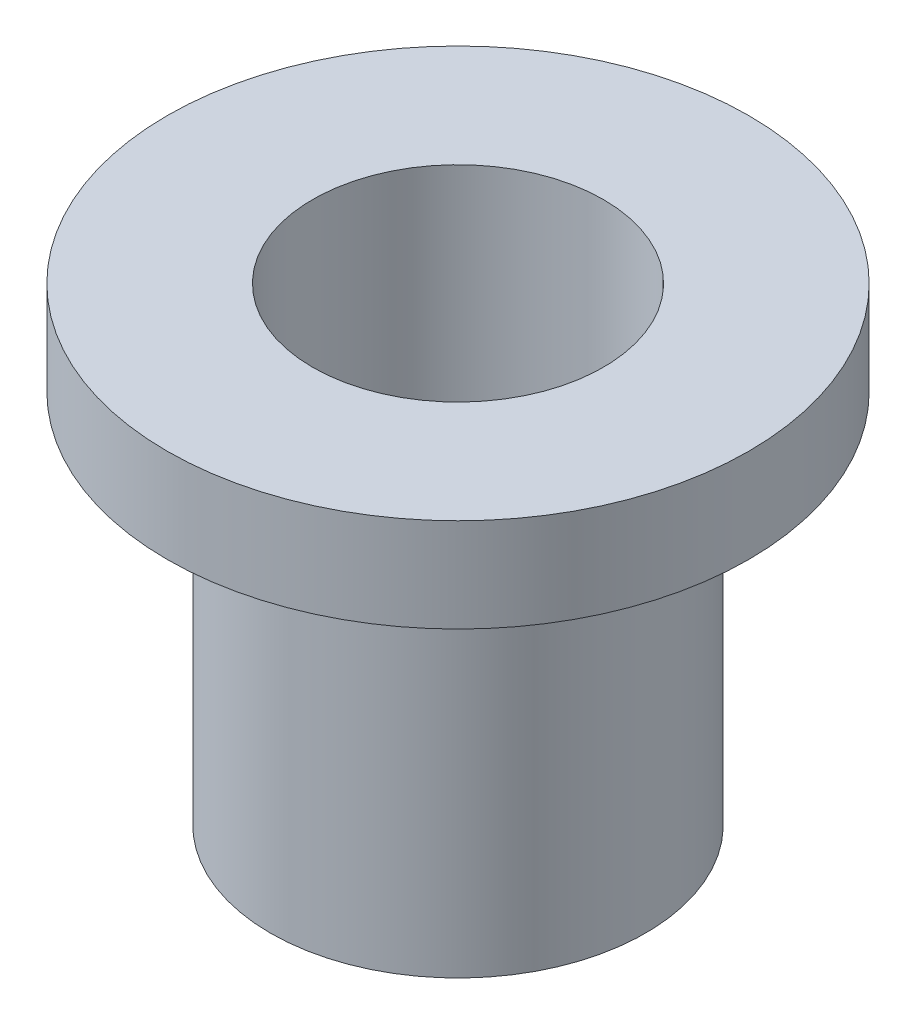
ISO-10303-21;
HEADER;
FILE_DESCRIPTION(('STEP AP214'),'2;1');
FILE_NAME('part.step','',(''),(''),'','','');
FILE_SCHEMA(('AUTOMOTIVE_DESIGN { 1 0 10303 214 1 1 1 1 }'));
ENDSEC;
DATA;
#1=APPLICATION_CONTEXT('core data for automotive mechanical design processes');
#2=APPLICATION_PROTOCOL_DEFINITION('international standard','automotive_design',2000,#1);
#3=PRODUCT_CONTEXT('',#1,'mechanical');
#4=PRODUCT('Part','Part','',(#3));
#5=PRODUCT_RELATED_PRODUCT_CATEGORY('part','',(#4));
#6=PRODUCT_DEFINITION_FORMATION('','',#4);
#7=PRODUCT_DEFINITION_CONTEXT('part definition',#1,'design');
#8=PRODUCT_DEFINITION('design','',#6,#7);
#9=PRODUCT_DEFINITION_SHAPE('','',#8);
#10=(LENGTH_UNIT() NAMED_UNIT(*) SI_UNIT(.MILLI.,.METRE.));
#11=(NAMED_UNIT(*) PLANE_ANGLE_UNIT() SI_UNIT($,.RADIAN.));
#12=(NAMED_UNIT(*) SI_UNIT($,.STERADIAN.) SOLID_ANGLE_UNIT());
#13=UNCERTAINTY_MEASURE_WITH_UNIT(LENGTH_MEASURE(1.E-05),#10,'distance_accuracy_value','');
#14=(GEOMETRIC_REPRESENTATION_CONTEXT(3) GLOBAL_UNCERTAINTY_ASSIGNED_CONTEXT((#13)) GLOBAL_UNIT_ASSIGNED_CONTEXT((#10,
#11,#12)) REPRESENTATION_CONTEXT('',''));
#15=CARTESIAN_POINT('',(0.,0.,0.));
#16=DIRECTION('',(0.,0.,1.));
#17=DIRECTION('',(1.,0.,0.));
#18=AXIS2_PLACEMENT_3D('',#15,#16,#17);
#19=CARTESIAN_POINT('',(0.,8.76171662125341,0.));
#20=DIRECTION('',(0.,1.,0.));
#21=DIRECTION('',(0.,0.,1.));
#22=AXIS2_PLACEMENT_3D('',#19,#20,#21);
#23=CYLINDRICAL_SURFACE('',#22,1.55);
#24=CARTESIAN_POINT('',(0.,-2.5,0.));
#25=DIRECTION('',(0.,1.,0.));
#26=DIRECTION('',(0.,0.,1.));
#27=AXIS2_PLACEMENT_3D('',#24,#25,#26);
#28=CIRCLE('',#27,1.55);
#29=CARTESIAN_POINT('',(0.,-2.5,1.55));
#30=VERTEX_POINT('',#29);
#31=EDGE_CURVE('E55',#30,#30,#28,.T.);
#32=ORIENTED_EDGE('',*,*,#31,.F.);
#33=EDGE_LOOP('',(#32));
#34=FACE_BOUND('',#33,.T.);
#35=CARTESIAN_POINT('',(0.,2.5,0.));
#36=DIRECTION('',(0.,1.,0.));
#37=DIRECTION('',(0.,0.,1.));
#38=AXIS2_PLACEMENT_3D('',#35,#36,#37);
#39=CIRCLE('',#38,1.55);
#40=CARTESIAN_POINT('',(0.,2.5,1.55));
#41=VERTEX_POINT('',#40);
#42=EDGE_CURVE('E10',#41,#41,#39,.T.);
#43=ORIENTED_EDGE('',*,*,#42,.T.);
#44=EDGE_LOOP('',(#43));
#45=FACE_BOUND('',#44,.T.);
#46=ADVANCED_FACE('F33',(#34,#45),#23,.F.);
#47=CARTESIAN_POINT('',(0.,2.5,-1.55));
#48=DIRECTION('',(0.,-1.,0.));
#49=DIRECTION('',(0.,0.,-1.));
#50=AXIS2_PLACEMENT_3D('',#47,#48,#49);
#51=PLANE('',#50);
#52=ORIENTED_EDGE('',*,*,#42,.F.);
#53=EDGE_LOOP('',(#52));
#54=FACE_BOUND('',#53,.T.);
#55=CARTESIAN_POINT('',(0.,2.5,0.));
#56=DIRECTION('',(0.,1.,0.));
#57=DIRECTION('',(0.,0.,1.));
#58=AXIS2_PLACEMENT_3D('',#55,#56,#57);
#59=CIRCLE('',#58,3.1);
#60=CARTESIAN_POINT('',(0.,2.5,3.1));
#61=VERTEX_POINT('',#60);
#62=EDGE_CURVE('E39',#61,#61,#59,.T.);
#63=ORIENTED_EDGE('',*,*,#62,.T.);
#64=EDGE_LOOP('',(#63));
#65=FACE_BOUND('',#64,.T.);
#66=ADVANCED_FACE('F62',(#54,#65),#51,.F.);
#67=CARTESIAN_POINT('',(0.,8.76171662125341,0.));
#68=DIRECTION('',(0.,1.,0.));
#69=DIRECTION('',(0.,0.,1.));
#70=AXIS2_PLACEMENT_3D('',#67,#68,#69);
#71=CYLINDRICAL_SURFACE('',#70,3.1);
#72=ORIENTED_EDGE('',*,*,#62,.F.);
#73=EDGE_LOOP('',(#72));
#74=FACE_BOUND('',#73,.T.);
#75=CARTESIAN_POINT('',(0.,1.5,0.));
#76=DIRECTION('',(0.,1.,0.));
#77=DIRECTION('',(0.,0.,1.));
#78=AXIS2_PLACEMENT_3D('',#75,#76,#77);
#79=CIRCLE('',#78,3.1);
#80=CARTESIAN_POINT('',(0.,1.5,3.1));
#81=VERTEX_POINT('',#80);
#82=EDGE_CURVE('E43',#81,#81,#79,.T.);
#83=ORIENTED_EDGE('',*,*,#82,.T.);
#84=EDGE_LOOP('',(#83));
#85=FACE_BOUND('',#84,.T.);
#86=ADVANCED_FACE('F66',(#74,#85),#71,.T.);
#87=CARTESIAN_POINT('',(0.,1.5,-3.1));
#88=DIRECTION('',(0.,1.,0.));
#89=DIRECTION('',(0.,0.,1.));
#90=AXIS2_PLACEMENT_3D('',#87,#88,#89);
#91=PLANE('',#90);
#92=ORIENTED_EDGE('',*,*,#82,.F.);
#93=EDGE_LOOP('',(#92));
#94=FACE_BOUND('',#93,.T.);
#95=CARTESIAN_POINT('',(0.,1.5,0.));
#96=DIRECTION('',(0.,1.,0.));
#97=DIRECTION('',(0.,0.,1.));
#98=AXIS2_PLACEMENT_3D('',#95,#96,#97);
#99=CIRCLE('',#98,2.);
#100=CARTESIAN_POINT('',(0.,1.5,2.));
#101=VERTEX_POINT('',#100);
#102=EDGE_CURVE('E47',#101,#101,#99,.T.);
#103=ORIENTED_EDGE('',*,*,#102,.T.);
#104=EDGE_LOOP('',(#103));
#105=FACE_BOUND('',#104,.T.);
#106=ADVANCED_FACE('F71',(#94,#105),#91,.F.);
#107=CARTESIAN_POINT('',(0.,8.76171662125341,0.));
#108=DIRECTION('',(0.,1.,0.));
#109=DIRECTION('',(0.,0.,1.));
#110=AXIS2_PLACEMENT_3D('',#107,#108,#109);
#111=CYLINDRICAL_SURFACE('',#110,2.);
#112=ORIENTED_EDGE('',*,*,#102,.F.);
#113=EDGE_LOOP('',(#112));
#114=FACE_BOUND('',#113,.T.);
#115=CARTESIAN_POINT('',(0.,-2.5,0.));
#116=DIRECTION('',(0.,1.,0.));
#117=DIRECTION('',(0.,0.,1.));
#118=AXIS2_PLACEMENT_3D('',#115,#116,#117);
#119=CIRCLE('',#118,2.);
#120=CARTESIAN_POINT('',(0.,-2.5,2.));
#121=VERTEX_POINT('',#120);
#122=EDGE_CURVE('E52',#121,#121,#119,.T.);
#123=ORIENTED_EDGE('',*,*,#122,.T.);
#124=EDGE_LOOP('',(#123));
#125=FACE_BOUND('',#124,.T.);
#126=ADVANCED_FACE('F77',(#114,#125),#111,.T.);
#127=CARTESIAN_POINT('',(0.,-2.5,-2.));
#128=DIRECTION('',(0.,1.,0.));
#129=DIRECTION('',(0.,0.,1.));
#130=AXIS2_PLACEMENT_3D('',#127,#128,#129);
#131=PLANE('',#130);
#132=ORIENTED_EDGE('',*,*,#122,.F.);
#133=EDGE_LOOP('',(#132));
#134=FACE_BOUND('',#133,.T.);
#135=ORIENTED_EDGE('',*,*,#31,.T.);
#136=EDGE_LOOP('',(#135));
#137=FACE_BOUND('',#136,.T.);
#138=ADVANCED_FACE('F59',(#134,#137),#131,.F.);
#139=CLOSED_SHELL('',(#46,#66,#86,#106,#126,#138));
#140=MANIFOLD_SOLID_BREP('B2',#139);
#141=ADVANCED_BREP_SHAPE_REPRESENTATION('',(#18,#140),#14);
#142=SHAPE_DEFINITION_REPRESENTATION(#9,#141);
ENDSEC;
END-ISO-10303-21;
